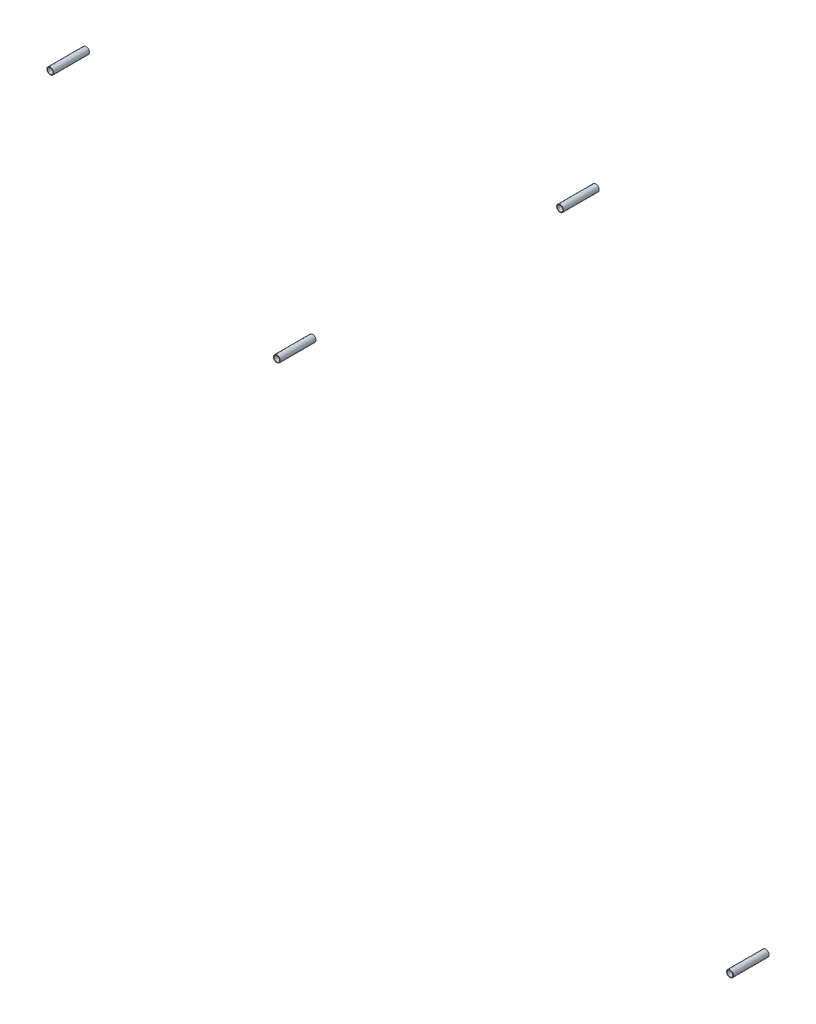
ISO-10303-21;
HEADER;
FILE_DESCRIPTION(('STEP AP214'),'2;1');
FILE_NAME('part.step','',(''),(''),'','','');
FILE_SCHEMA(('AUTOMOTIVE_DESIGN { 1 0 10303 214 1 1 1 1 }'));
ENDSEC;
DATA;
#1=APPLICATION_CONTEXT('core data for automotive mechanical design processes');
#2=APPLICATION_PROTOCOL_DEFINITION('international standard','automotive_design',2000,#1);
#3=PRODUCT_CONTEXT('',#1,'mechanical');
#4=PRODUCT('Part','Part','',(#3));
#5=PRODUCT_RELATED_PRODUCT_CATEGORY('part','',(#4));
#6=PRODUCT_DEFINITION_FORMATION('','',#4);
#7=PRODUCT_DEFINITION_CONTEXT('part definition',#1,'design');
#8=PRODUCT_DEFINITION('design','',#6,#7);
#9=PRODUCT_DEFINITION_SHAPE('','',#8);
#10=(LENGTH_UNIT() NAMED_UNIT(*) SI_UNIT(.MILLI.,.METRE.));
#11=(NAMED_UNIT(*) PLANE_ANGLE_UNIT() SI_UNIT($,.RADIAN.));
#12=(NAMED_UNIT(*) SI_UNIT($,.STERADIAN.) SOLID_ANGLE_UNIT());
#13=UNCERTAINTY_MEASURE_WITH_UNIT(LENGTH_MEASURE(1.E-05),#10,'distance_accuracy_value','');
#14=(GEOMETRIC_REPRESENTATION_CONTEXT(3) GLOBAL_UNCERTAINTY_ASSIGNED_CONTEXT((#13)) GLOBAL_UNIT_ASSIGNED_CONTEXT((#10,
#11,#12)) REPRESENTATION_CONTEXT('',''));
#15=CARTESIAN_POINT('',(0.,0.,0.));
#16=DIRECTION('',(0.,0.,1.));
#17=DIRECTION('',(1.,0.,0.));
#18=AXIS2_PLACEMENT_3D('',#15,#16,#17);
#19=CARTESIAN_POINT('',(122.5,-91.5,-0.036));
#20=DIRECTION('',(0.,0.,-1.));
#21=DIRECTION('',(0.,-1.,0.));
#22=AXIS2_PLACEMENT_3D('',#19,#20,#21);
#23=CYLINDRICAL_SURFACE('',#22,0.125);
#24=CARTESIAN_POINT('',(122.5,-91.5,-0.035));
#25=DIRECTION('',(0.,0.,-1.));
#26=DIRECTION('',(0.,-1.,0.));
#27=AXIS2_PLACEMENT_3D('',#24,#25,#26);
#28=CIRCLE('',#27,0.125);
#29=CARTESIAN_POINT('',(122.5,-91.625,-0.035));
#30=VERTEX_POINT('',#29);
#31=EDGE_CURVE('P0_E63',#30,#30,#28,.T.);
#32=ORIENTED_EDGE('',*,*,#31,.T.);
#33=DIRECTION('',(0.,0.,1.));
#34=VECTOR('',#33,1.);
#35=CARTESIAN_POINT('',(122.5,-91.625,-0.036));
#36=LINE('',#35,#34);
#37=CARTESIAN_POINT('',(122.5,-91.625,1.545));
#38=VERTEX_POINT('',#37);
#39=EDGE_CURVE('P0_E11',#30,#38,#36,.T.);
#40=ORIENTED_EDGE('',*,*,#39,.T.);
#41=CARTESIAN_POINT('',(122.5,-91.5,1.545));
#42=DIRECTION('',(0.,0.,-1.));
#43=DIRECTION('',(0.,-1.,0.));
#44=AXIS2_PLACEMENT_3D('',#41,#42,#43);
#45=CIRCLE('',#44,0.125);
#46=EDGE_CURVE('P0_E20',#38,#38,#45,.T.);
#47=ORIENTED_EDGE('',*,*,#46,.F.);
#48=ORIENTED_EDGE('',*,*,#39,.F.);
#49=EDGE_LOOP('',(#32,#40,#47,#48));
#50=FACE_BOUND('',#49,.T.);
#51=ADVANCED_FACE('P0_F17',(#50),#23,.F.);
#52=CARTESIAN_POINT('',(122.5,-91.65,1.545));
#53=DIRECTION('',(0.,0.,1.));
#54=DIRECTION('',(1.,0.,0.));
#55=AXIS2_PLACEMENT_3D('',#52,#53,#54);
#56=PLANE('',#55);
#57=ORIENTED_EDGE('',*,*,#46,.T.);
#58=EDGE_LOOP('',(#57));
#59=FACE_BOUND('',#58,.T.);
#60=CARTESIAN_POINT('',(122.5,-91.5,1.545));
#61=DIRECTION('',(0.,0.,1.));
#62=DIRECTION('',(0.,-1.,0.));
#63=AXIS2_PLACEMENT_3D('',#60,#61,#62);
#64=CIRCLE('',#63,0.15);
#65=CARTESIAN_POINT('',(122.5,-91.65,1.545));
#66=VERTEX_POINT('',#65);
#67=EDGE_CURVE('P0_E57',#66,#66,#64,.T.);
#68=ORIENTED_EDGE('',*,*,#67,.T.);
#69=EDGE_LOOP('',(#68));
#70=FACE_BOUND('',#69,.T.);
#71=ADVANCED_FACE('P0_F76',(#59,#70),#56,.T.);
#72=CARTESIAN_POINT('',(122.5,-91.65,-0.035));
#73=DIRECTION('',(0.,0.,1.));
#74=DIRECTION('',(1.,0.,0.));
#75=AXIS2_PLACEMENT_3D('',#72,#73,#74);
#76=PLANE('',#75);
#77=ORIENTED_EDGE('',*,*,#31,.F.);
#78=EDGE_LOOP('',(#77));
#79=FACE_BOUND('',#78,.T.);
#80=CARTESIAN_POINT('',(122.5,-91.5,-0.035));
#81=DIRECTION('',(0.,0.,1.));
#82=DIRECTION('',(0.,-1.,0.));
#83=AXIS2_PLACEMENT_3D('',#80,#81,#82);
#84=CIRCLE('',#83,0.15);
#85=CARTESIAN_POINT('',(122.5,-91.65,-0.035));
#86=VERTEX_POINT('',#85);
#87=EDGE_CURVE('P0_E54',#86,#86,#84,.T.);
#88=ORIENTED_EDGE('',*,*,#87,.F.);
#89=EDGE_LOOP('',(#88));
#90=FACE_BOUND('',#89,.T.);
#91=ADVANCED_FACE('P0_F81',(#79,#90),#76,.F.);
#92=CARTESIAN_POINT('',(122.5,-91.5,-0.035));
#93=DIRECTION('',(0.,0.,-1.));
#94=DIRECTION('',(0.,-1.,0.));
#95=AXIS2_PLACEMENT_3D('',#92,#93,#94);
#96=CYLINDRICAL_SURFACE('',#95,0.15);
#97=ORIENTED_EDGE('',*,*,#87,.T.);
#98=DIRECTION('',(0.,0.,1.));
#99=VECTOR('',#98,1.);
#100=CARTESIAN_POINT('',(122.5,-91.65,-0.035));
#101=LINE('',#100,#99);
#102=EDGE_CURVE('P0_E55',#86,#66,#101,.T.);
#103=ORIENTED_EDGE('',*,*,#102,.T.);
#104=ORIENTED_EDGE('',*,*,#67,.F.);
#105=ORIENTED_EDGE('',*,*,#102,.F.);
#106=EDGE_LOOP('',(#97,#103,#104,#105));
#107=FACE_BOUND('',#106,.T.);
#108=ADVANCED_FACE('P0_F52',(#107),#96,.T.);
#109=CLOSED_SHELL('',(#51,#71,#91,#108));
#110=MANIFOLD_SOLID_BREP('P0_B1',#109);
#111=CARTESIAN_POINT('',(112.5,-85.5,-0.036));
#112=DIRECTION('',(0.,0.,-1.));
#113=DIRECTION('',(0.,-1.,0.));
#114=AXIS2_PLACEMENT_3D('',#111,#112,#113);
#115=CYLINDRICAL_SURFACE('',#114,0.125);
#116=CARTESIAN_POINT('',(112.5,-85.5,-0.035));
#117=DIRECTION('',(0.,0.,-1.));
#118=DIRECTION('',(0.,-1.,0.));
#119=AXIS2_PLACEMENT_3D('',#116,#117,#118);
#120=CIRCLE('',#119,0.125);
#121=CARTESIAN_POINT('',(112.5,-85.625,-0.035));
#122=VERTEX_POINT('',#121);
#123=EDGE_CURVE('P1_E52',#122,#122,#120,.T.);
#124=ORIENTED_EDGE('',*,*,#123,.T.);
#125=DIRECTION('',(0.,0.,1.));
#126=VECTOR('',#125,1.);
#127=CARTESIAN_POINT('',(112.5,-85.625,-0.036));
#128=LINE('',#127,#126);
#129=CARTESIAN_POINT('',(112.5,-85.625,1.545));
#130=VERTEX_POINT('',#129);
#131=EDGE_CURVE('P1_E11',#122,#130,#128,.T.);
#132=ORIENTED_EDGE('',*,*,#131,.T.);
#133=CARTESIAN_POINT('',(112.5,-85.5,1.545));
#134=DIRECTION('',(0.,0.,-1.));
#135=DIRECTION('',(0.,-1.,0.));
#136=AXIS2_PLACEMENT_3D('',#133,#134,#135);
#137=CIRCLE('',#136,0.125);
#138=EDGE_CURVE('P1_E20',#130,#130,#137,.T.);
#139=ORIENTED_EDGE('',*,*,#138,.F.);
#140=ORIENTED_EDGE('',*,*,#131,.F.);
#141=EDGE_LOOP('',(#124,#132,#139,#140));
#142=FACE_BOUND('',#141,.T.);
#143=ADVANCED_FACE('P1_F17',(#142),#115,.F.);
#144=CARTESIAN_POINT('',(112.5,-85.65,1.545));
#145=DIRECTION('',(0.,0.,1.));
#146=DIRECTION('',(1.,0.,0.));
#147=AXIS2_PLACEMENT_3D('',#144,#145,#146);
#148=PLANE('',#147);
#149=ORIENTED_EDGE('',*,*,#138,.T.);
#150=EDGE_LOOP('',(#149));
#151=FACE_BOUND('',#150,.T.);
#152=CARTESIAN_POINT('',(112.5,-85.5,1.545));
#153=DIRECTION('',(0.,0.,1.));
#154=DIRECTION('',(0.,-1.,0.));
#155=AXIS2_PLACEMENT_3D('',#152,#153,#154);
#156=CIRCLE('',#155,0.15);
#157=CARTESIAN_POINT('',(112.5,-85.65,1.545));
#158=VERTEX_POINT('',#157);
#159=EDGE_CURVE('P1_E48',#158,#158,#156,.T.);
#160=ORIENTED_EDGE('',*,*,#159,.T.);
#161=EDGE_LOOP('',(#160));
#162=FACE_BOUND('',#161,.T.);
#163=ADVANCED_FACE('P1_F47',(#151,#162),#148,.T.);
#164=CARTESIAN_POINT('',(112.5,-85.65,-0.035));
#165=DIRECTION('',(0.,0.,1.));
#166=DIRECTION('',(1.,0.,0.));
#167=AXIS2_PLACEMENT_3D('',#164,#165,#166);
#168=PLANE('',#167);
#169=ORIENTED_EDGE('',*,*,#123,.F.);
#170=EDGE_LOOP('',(#169));
#171=FACE_BOUND('',#170,.T.);
#172=CARTESIAN_POINT('',(112.5,-85.5,-0.035));
#173=DIRECTION('',(0.,0.,1.));
#174=DIRECTION('',(0.,-1.,0.));
#175=AXIS2_PLACEMENT_3D('',#172,#173,#174);
#176=CIRCLE('',#175,0.15);
#177=CARTESIAN_POINT('',(112.5,-85.65,-0.035));
#178=VERTEX_POINT('',#177);
#179=EDGE_CURVE('P1_E62',#178,#178,#176,.T.);
#180=ORIENTED_EDGE('',*,*,#179,.F.);
#181=EDGE_LOOP('',(#180));
#182=FACE_BOUND('',#181,.T.);
#183=ADVANCED_FACE('P1_F71',(#171,#182),#168,.F.);
#184=CARTESIAN_POINT('',(112.5,-85.5,-0.035));
#185=DIRECTION('',(0.,0.,-1.));
#186=DIRECTION('',(0.,-1.,0.));
#187=AXIS2_PLACEMENT_3D('',#184,#185,#186);
#188=CYLINDRICAL_SURFACE('',#187,0.15);
#189=ORIENTED_EDGE('',*,*,#179,.T.);
#190=DIRECTION('',(0.,0.,1.));
#191=VECTOR('',#190,1.);
#192=CARTESIAN_POINT('',(112.5,-85.65,-0.035));
#193=LINE('',#192,#191);
#194=EDGE_CURVE('P1_E53',#178,#158,#193,.T.);
#195=ORIENTED_EDGE('',*,*,#194,.T.);
#196=ORIENTED_EDGE('',*,*,#159,.F.);
#197=ORIENTED_EDGE('',*,*,#194,.F.);
#198=EDGE_LOOP('',(#189,#195,#196,#197));
#199=FACE_BOUND('',#198,.T.);
#200=ADVANCED_FACE('P1_F68',(#199),#188,.T.);
#201=CLOSED_SHELL('',(#143,#163,#183,#200));
#202=MANIFOLD_SOLID_BREP('P1_B1',#201);
#203=CARTESIAN_POINT('',(142.5,-105.,-0.036));
#204=DIRECTION('',(0.,0.,-1.));
#205=DIRECTION('',(0.,-1.,0.));
#206=AXIS2_PLACEMENT_3D('',#203,#204,#205);
#207=CYLINDRICAL_SURFACE('',#206,0.125);
#208=CARTESIAN_POINT('',(142.5,-105.,-0.035));
#209=DIRECTION('',(0.,0.,-1.));
#210=DIRECTION('',(0.,-1.,0.));
#211=AXIS2_PLACEMENT_3D('',#208,#209,#210);
#212=CIRCLE('',#211,0.125);
#213=CARTESIAN_POINT('',(142.5,-105.125,-0.035));
#214=VERTEX_POINT('',#213);
#215=EDGE_CURVE('P2_E63',#214,#214,#212,.T.);
#216=ORIENTED_EDGE('',*,*,#215,.T.);
#217=DIRECTION('',(0.,0.,1.));
#218=VECTOR('',#217,1.);
#219=CARTESIAN_POINT('',(142.5,-105.125,-0.036));
#220=LINE('',#219,#218);
#221=CARTESIAN_POINT('',(142.5,-105.125,1.545));
#222=VERTEX_POINT('',#221);
#223=EDGE_CURVE('P2_E11',#214,#222,#220,.T.);
#224=ORIENTED_EDGE('',*,*,#223,.T.);
#225=CARTESIAN_POINT('',(142.5,-105.,1.545));
#226=DIRECTION('',(0.,0.,-1.));
#227=DIRECTION('',(0.,-1.,0.));
#228=AXIS2_PLACEMENT_3D('',#225,#226,#227);
#229=CIRCLE('',#228,0.125);
#230=EDGE_CURVE('P2_E25',#222,#222,#229,.T.);
#231=ORIENTED_EDGE('',*,*,#230,.F.);
#232=ORIENTED_EDGE('',*,*,#223,.F.);
#233=EDGE_LOOP('',(#216,#224,#231,#232));
#234=FACE_BOUND('',#233,.T.);
#235=ADVANCED_FACE('P2_F17',(#234),#207,.F.);
#236=CARTESIAN_POINT('',(142.5,-105.15,1.545));
#237=DIRECTION('',(0.,0.,1.));
#238=DIRECTION('',(1.,0.,0.));
#239=AXIS2_PLACEMENT_3D('',#236,#237,#238);
#240=PLANE('',#239);
#241=ORIENTED_EDGE('',*,*,#230,.T.);
#242=EDGE_LOOP('',(#241));
#243=FACE_BOUND('',#242,.T.);
#244=CARTESIAN_POINT('',(142.5,-105.,1.545));
#245=DIRECTION('',(0.,0.,1.));
#246=DIRECTION('',(0.,-1.,0.));
#247=AXIS2_PLACEMENT_3D('',#244,#245,#246);
#248=CIRCLE('',#247,0.15);
#249=CARTESIAN_POINT('',(142.5,-105.15,1.545));
#250=VERTEX_POINT('',#249);
#251=EDGE_CURVE('P2_E57',#250,#250,#248,.T.);
#252=ORIENTED_EDGE('',*,*,#251,.T.);
#253=EDGE_LOOP('',(#252));
#254=FACE_BOUND('',#253,.T.);
#255=ADVANCED_FACE('P2_F73',(#243,#254),#240,.T.);
#256=CARTESIAN_POINT('',(142.5,-105.15,-0.035));
#257=DIRECTION('',(0.,0.,1.));
#258=DIRECTION('',(1.,0.,0.));
#259=AXIS2_PLACEMENT_3D('',#256,#257,#258);
#260=PLANE('',#259);
#261=ORIENTED_EDGE('',*,*,#215,.F.);
#262=EDGE_LOOP('',(#261));
#263=FACE_BOUND('',#262,.T.);
#264=CARTESIAN_POINT('',(142.5,-105.,-0.035));
#265=DIRECTION('',(0.,0.,1.));
#266=DIRECTION('',(0.,-1.,0.));
#267=AXIS2_PLACEMENT_3D('',#264,#265,#266);
#268=CIRCLE('',#267,0.15);
#269=CARTESIAN_POINT('',(142.5,-105.15,-0.035));
#270=VERTEX_POINT('',#269);
#271=EDGE_CURVE('P2_E54',#270,#270,#268,.T.);
#272=ORIENTED_EDGE('',*,*,#271,.F.);
#273=EDGE_LOOP('',(#272));
#274=FACE_BOUND('',#273,.T.);
#275=ADVANCED_FACE('P2_F85',(#263,#274),#260,.F.);
#276=CARTESIAN_POINT('',(142.5,-105.,-0.035));
#277=DIRECTION('',(0.,0.,-1.));
#278=DIRECTION('',(0.,-1.,0.));
#279=AXIS2_PLACEMENT_3D('',#276,#277,#278);
#280=CYLINDRICAL_SURFACE('',#279,0.15);
#281=ORIENTED_EDGE('',*,*,#271,.T.);
#282=DIRECTION('',(0.,0.,1.));
#283=VECTOR('',#282,1.);
#284=CARTESIAN_POINT('',(142.5,-105.15,-0.035));
#285=LINE('',#284,#283);
#286=EDGE_CURVE('P2_E55',#270,#250,#285,.T.);
#287=ORIENTED_EDGE('',*,*,#286,.T.);
#288=ORIENTED_EDGE('',*,*,#251,.F.);
#289=ORIENTED_EDGE('',*,*,#286,.F.);
#290=EDGE_LOOP('',(#281,#287,#288,#289));
#291=FACE_BOUND('',#290,.T.);
#292=ADVANCED_FACE('P2_F52',(#291),#280,.T.);
#293=CLOSED_SHELL('',(#235,#255,#275,#292));
#294=MANIFOLD_SOLID_BREP('P2_B1',#293);
#295=CARTESIAN_POINT('',(135.,-79.5,-0.036));
#296=DIRECTION('',(0.,0.,-1.));
#297=DIRECTION('',(0.,-1.,0.));
#298=AXIS2_PLACEMENT_3D('',#295,#296,#297);
#299=CYLINDRICAL_SURFACE('',#298,0.125);
#300=CARTESIAN_POINT('',(135.,-79.5,-0.035));
#301=DIRECTION('',(0.,0.,-1.));
#302=DIRECTION('',(0.,-1.,0.));
#303=AXIS2_PLACEMENT_3D('',#300,#301,#302);
#304=CIRCLE('',#303,0.125);
#305=CARTESIAN_POINT('',(135.,-79.625,-0.035));
#306=VERTEX_POINT('',#305);
#307=EDGE_CURVE('P3_E63',#306,#306,#304,.T.);
#308=ORIENTED_EDGE('',*,*,#307,.T.);
#309=DIRECTION('',(0.,0.,1.));
#310=VECTOR('',#309,1.);
#311=CARTESIAN_POINT('',(135.,-79.625,-0.036));
#312=LINE('',#311,#310);
#313=CARTESIAN_POINT('',(135.,-79.625,1.545));
#314=VERTEX_POINT('',#313);
#315=EDGE_CURVE('P3_E11',#306,#314,#312,.T.);
#316=ORIENTED_EDGE('',*,*,#315,.T.);
#317=CARTESIAN_POINT('',(135.,-79.5,1.545));
#318=DIRECTION('',(0.,0.,-1.));
#319=DIRECTION('',(0.,-1.,0.));
#320=AXIS2_PLACEMENT_3D('',#317,#318,#319);
#321=CIRCLE('',#320,0.125);
#322=EDGE_CURVE('P3_E25',#314,#314,#321,.T.);
#323=ORIENTED_EDGE('',*,*,#322,.F.);
#324=ORIENTED_EDGE('',*,*,#315,.F.);
#325=EDGE_LOOP('',(#308,#316,#323,#324));
#326=FACE_BOUND('',#325,.T.);
#327=ADVANCED_FACE('P3_F17',(#326),#299,.F.);
#328=CARTESIAN_POINT('',(135.,-79.65,1.545));
#329=DIRECTION('',(0.,0.,1.));
#330=DIRECTION('',(1.,0.,0.));
#331=AXIS2_PLACEMENT_3D('',#328,#329,#330);
#332=PLANE('',#331);
#333=ORIENTED_EDGE('',*,*,#322,.T.);
#334=EDGE_LOOP('',(#333));
#335=FACE_BOUND('',#334,.T.);
#336=CARTESIAN_POINT('',(135.,-79.5,1.545));
#337=DIRECTION('',(0.,0.,1.));
#338=DIRECTION('',(0.,-1.,0.));
#339=AXIS2_PLACEMENT_3D('',#336,#337,#338);
#340=CIRCLE('',#339,0.15);
#341=CARTESIAN_POINT('',(135.,-79.65,1.545));
#342=VERTEX_POINT('',#341);
#343=EDGE_CURVE('P3_E57',#342,#342,#340,.T.);
#344=ORIENTED_EDGE('',*,*,#343,.T.);
#345=EDGE_LOOP('',(#344));
#346=FACE_BOUND('',#345,.T.);
#347=ADVANCED_FACE('P3_F80',(#335,#346),#332,.T.);
#348=CARTESIAN_POINT('',(135.,-79.65,-0.035));
#349=DIRECTION('',(0.,0.,1.));
#350=DIRECTION('',(1.,0.,0.));
#351=AXIS2_PLACEMENT_3D('',#348,#349,#350);
#352=PLANE('',#351);
#353=ORIENTED_EDGE('',*,*,#307,.F.);
#354=EDGE_LOOP('',(#353));
#355=FACE_BOUND('',#354,.T.);
#356=CARTESIAN_POINT('',(135.,-79.5,-0.035));
#357=DIRECTION('',(0.,0.,1.));
#358=DIRECTION('',(0.,-1.,0.));
#359=AXIS2_PLACEMENT_3D('',#356,#357,#358);
#360=CIRCLE('',#359,0.15);
#361=CARTESIAN_POINT('',(135.,-79.65,-0.035));
#362=VERTEX_POINT('',#361);
#363=EDGE_CURVE('P3_E54',#362,#362,#360,.T.);
#364=ORIENTED_EDGE('',*,*,#363,.F.);
#365=EDGE_LOOP('',(#364));
#366=FACE_BOUND('',#365,.T.);
#367=ADVANCED_FACE('P3_F72',(#355,#366),#352,.F.);
#368=CARTESIAN_POINT('',(135.,-79.5,-0.035));
#369=DIRECTION('',(0.,0.,-1.));
#370=DIRECTION('',(0.,-1.,0.));
#371=AXIS2_PLACEMENT_3D('',#368,#369,#370);
#372=CYLINDRICAL_SURFACE('',#371,0.15);
#373=ORIENTED_EDGE('',*,*,#363,.T.);
#374=DIRECTION('',(0.,0.,1.));
#375=VECTOR('',#374,1.);
#376=CARTESIAN_POINT('',(135.,-79.65,-0.035));
#377=LINE('',#376,#375);
#378=EDGE_CURVE('P3_E55',#362,#342,#377,.T.);
#379=ORIENTED_EDGE('',*,*,#378,.T.);
#380=ORIENTED_EDGE('',*,*,#343,.F.);
#381=ORIENTED_EDGE('',*,*,#378,.F.);
#382=EDGE_LOOP('',(#373,#379,#380,#381));
#383=FACE_BOUND('',#382,.T.);
#384=ADVANCED_FACE('P3_F52',(#383),#372,.T.);
#385=CLOSED_SHELL('',(#327,#347,#367,#384));
#386=MANIFOLD_SOLID_BREP('P3_B1',#385);
#387=ADVANCED_BREP_SHAPE_REPRESENTATION('',(#18,#110,#202,#294,#386),#14);
#388=SHAPE_DEFINITION_REPRESENTATION(#9,#387);
ENDSEC;
END-ISO-10303-21;
